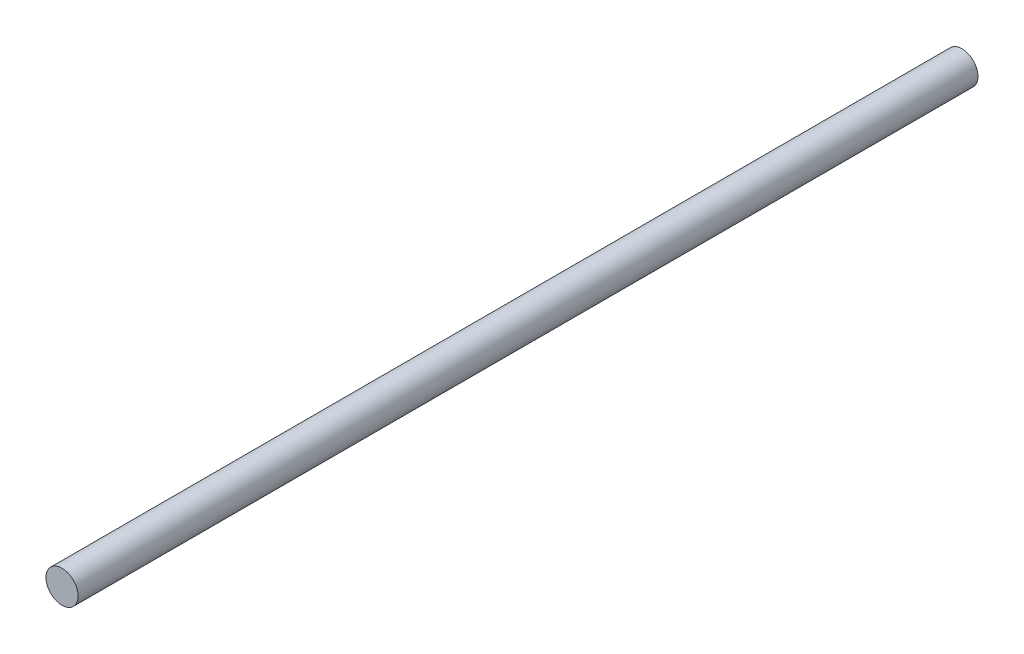
ISO-10303-21;
HEADER;
FILE_DESCRIPTION(('STEP AP214'),'2;1');
FILE_NAME('part.step','',(''),(''),'','','');
FILE_SCHEMA(('AUTOMOTIVE_DESIGN { 1 0 10303 214 1 1 1 1 }'));
ENDSEC;
DATA;
#1=APPLICATION_CONTEXT('core data for automotive mechanical design processes');
#2=APPLICATION_PROTOCOL_DEFINITION('international standard','automotive_design',2000,#1);
#3=PRODUCT_CONTEXT('',#1,'mechanical');
#4=PRODUCT('Part','Part','',(#3));
#5=PRODUCT_RELATED_PRODUCT_CATEGORY('part','',(#4));
#6=PRODUCT_DEFINITION_FORMATION('','',#4);
#7=PRODUCT_DEFINITION_CONTEXT('part definition',#1,'design');
#8=PRODUCT_DEFINITION('design','',#6,#7);
#9=PRODUCT_DEFINITION_SHAPE('','',#8);
#10=(LENGTH_UNIT() NAMED_UNIT(*) SI_UNIT(.MILLI.,.METRE.));
#11=(NAMED_UNIT(*) PLANE_ANGLE_UNIT() SI_UNIT($,.RADIAN.));
#12=(NAMED_UNIT(*) SI_UNIT($,.STERADIAN.) SOLID_ANGLE_UNIT());
#13=UNCERTAINTY_MEASURE_WITH_UNIT(LENGTH_MEASURE(1.E-05),#10,'distance_accuracy_value','');
#14=(GEOMETRIC_REPRESENTATION_CONTEXT(3) GLOBAL_UNCERTAINTY_ASSIGNED_CONTEXT((#13)) GLOBAL_UNIT_ASSIGNED_CONTEXT((#10,
#11,#12)) REPRESENTATION_CONTEXT('',''));
#15=CARTESIAN_POINT('',(0.,0.,0.));
#16=DIRECTION('',(0.,0.,1.));
#17=DIRECTION('',(1.,0.,0.));
#18=AXIS2_PLACEMENT_3D('',#15,#16,#17);
#19=CARTESIAN_POINT('',(0.,0.,224.));
#20=DIRECTION('',(0.,0.,-1.));
#21=DIRECTION('',(-1.,0.,0.));
#22=AXIS2_PLACEMENT_3D('',#19,#20,#21);
#23=CYLINDRICAL_SURFACE('',#22,4.);
#24=CARTESIAN_POINT('',(0.,0.,224.));
#25=DIRECTION('',(0.,0.,1.));
#26=DIRECTION('',(1.,0.,0.));
#27=AXIS2_PLACEMENT_3D('',#24,#25,#26);
#28=CIRCLE('',#27,4.);
#29=CARTESIAN_POINT('',(4.,0.,224.));
#30=VERTEX_POINT('',#29);
#31=EDGE_CURVE('E10',#30,#30,#28,.T.);
#32=ORIENTED_EDGE('',*,*,#31,.F.);
#33=EDGE_LOOP('',(#32));
#34=FACE_BOUND('',#33,.T.);
#35=CARTESIAN_POINT('',(0.,0.,0.));
#36=DIRECTION('',(0.,0.,1.));
#37=DIRECTION('',(1.,0.,0.));
#38=AXIS2_PLACEMENT_3D('',#35,#36,#37);
#39=CIRCLE('',#38,4.);
#40=CARTESIAN_POINT('',(4.,0.,0.));
#41=VERTEX_POINT('',#40);
#42=EDGE_CURVE('E34',#41,#41,#39,.T.);
#43=ORIENTED_EDGE('',*,*,#42,.T.);
#44=EDGE_LOOP('',(#43));
#45=FACE_BOUND('',#44,.T.);
#46=ADVANCED_FACE('F31',(#34,#45),#23,.T.);
#47=CARTESIAN_POINT('',(0.,0.,224.));
#48=DIRECTION('',(0.,0.,1.));
#49=DIRECTION('',(1.,0.,0.));
#50=AXIS2_PLACEMENT_3D('',#47,#48,#49);
#51=PLANE('',#50);
#52=ORIENTED_EDGE('',*,*,#31,.T.);
#53=EDGE_LOOP('',(#52));
#54=FACE_BOUND('',#53,.T.);
#55=ADVANCED_FACE('F46',(#54),#51,.T.);
#56=CARTESIAN_POINT('',(0.,0.,0.));
#57=DIRECTION('',(0.,0.,1.));
#58=DIRECTION('',(1.,0.,0.));
#59=AXIS2_PLACEMENT_3D('',#56,#57,#58);
#60=PLANE('',#59);
#61=ORIENTED_EDGE('',*,*,#42,.F.);
#62=EDGE_LOOP('',(#61));
#63=FACE_BOUND('',#62,.T.);
#64=ADVANCED_FACE('F44',(#63),#60,.F.);
#65=CLOSED_SHELL('',(#46,#55,#64));
#66=MANIFOLD_SOLID_BREP('B2',#65);
#67=ADVANCED_BREP_SHAPE_REPRESENTATION('',(#18,#66),#14);
#68=SHAPE_DEFINITION_REPRESENTATION(#9,#67);
ENDSEC;
END-ISO-10303-21;
